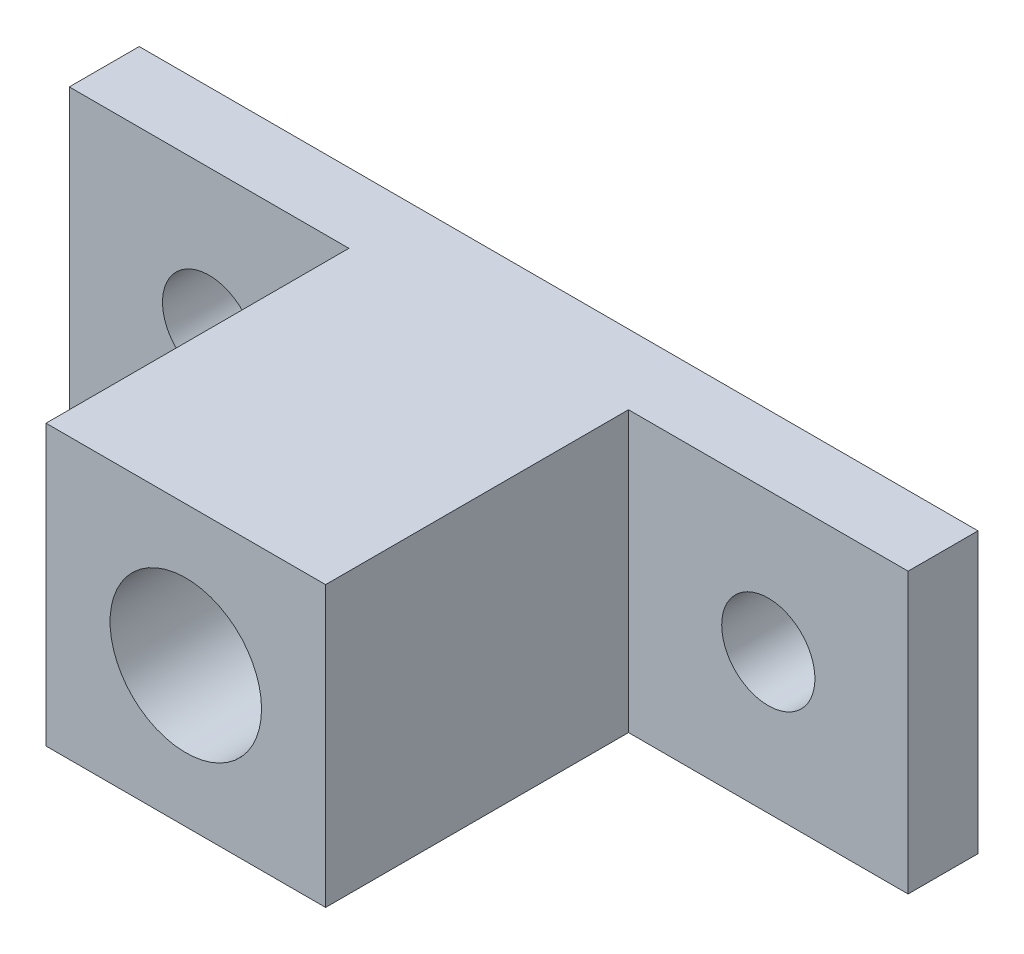
ISO-10303-21;
HEADER;
FILE_DESCRIPTION(('STEP AP214'),'2;1');
FILE_NAME('part.step','',(''),(''),'','','');
FILE_SCHEMA(('AUTOMOTIVE_DESIGN { 1 0 10303 214 1 1 1 1 }'));
ENDSEC;
DATA;
#1=APPLICATION_CONTEXT('core data for automotive mechanical design processes');
#2=APPLICATION_PROTOCOL_DEFINITION('international standard','automotive_design',2000,#1);
#3=PRODUCT_CONTEXT('',#1,'mechanical');
#4=PRODUCT('Part','Part','',(#3));
#5=PRODUCT_RELATED_PRODUCT_CATEGORY('part','',(#4));
#6=PRODUCT_DEFINITION_FORMATION('','',#4);
#7=PRODUCT_DEFINITION_CONTEXT('part definition',#1,'design');
#8=PRODUCT_DEFINITION('design','',#6,#7);
#9=PRODUCT_DEFINITION_SHAPE('','',#8);
#10=(LENGTH_UNIT() NAMED_UNIT(*) SI_UNIT(.MILLI.,.METRE.));
#11=(NAMED_UNIT(*) PLANE_ANGLE_UNIT() SI_UNIT($,.RADIAN.));
#12=(NAMED_UNIT(*) SI_UNIT($,.STERADIAN.) SOLID_ANGLE_UNIT());
#13=UNCERTAINTY_MEASURE_WITH_UNIT(LENGTH_MEASURE(1.E-05),#10,'distance_accuracy_value','');
#14=(GEOMETRIC_REPRESENTATION_CONTEXT(3) GLOBAL_UNCERTAINTY_ASSIGNED_CONTEXT((#13)) GLOBAL_UNIT_ASSIGNED_CONTEXT((#10,
#11,#12)) REPRESENTATION_CONTEXT('',''));
#15=CARTESIAN_POINT('',(0.,0.,0.));
#16=DIRECTION('',(0.,0.,1.));
#17=DIRECTION('',(1.,0.,0.));
#18=AXIS2_PLACEMENT_3D('',#15,#16,#17);
#19=CARTESIAN_POINT('',(18.,-6.,8.));
#20=DIRECTION('',(-1.,0.,0.));
#21=DIRECTION('',(0.,0.,1.));
#22=AXIS2_PLACEMENT_3D('',#19,#20,#21);
#23=PLANE('',#22);
#24=DIRECTION('',(0.,0.,-1.));
#25=VECTOR('',#24,1.);
#26=CARTESIAN_POINT('',(18.,6.,8.));
#27=LINE('',#26,#25);
#28=CARTESIAN_POINT('',(18.,6.,-5.));
#29=VERTEX_POINT('',#28);
#30=CARTESIAN_POINT('',(18.,6.,-8.));
#31=VERTEX_POINT('',#30);
#32=EDGE_CURVE('E11',#29,#31,#27,.T.);
#33=ORIENTED_EDGE('',*,*,#32,.F.);
#34=DIRECTION('',(0.,-1.,0.));
#35=VECTOR('',#34,1.);
#36=CARTESIAN_POINT('',(18.,6.,-5.));
#37=LINE('',#36,#35);
#38=CARTESIAN_POINT('',(18.,-6.,-5.));
#39=VERTEX_POINT('',#38);
#40=EDGE_CURVE('E174',#29,#39,#37,.T.);
#41=ORIENTED_EDGE('',*,*,#40,.T.);
#42=DIRECTION('',(0.,0.,-1.));
#43=VECTOR('',#42,1.);
#44=CARTESIAN_POINT('',(18.,-6.,8.));
#45=LINE('',#44,#43);
#46=CARTESIAN_POINT('',(18.,-6.,-8.));
#47=VERTEX_POINT('',#46);
#48=EDGE_CURVE('E132',#39,#47,#45,.T.);
#49=ORIENTED_EDGE('',*,*,#48,.T.);
#50=DIRECTION('',(0.,1.,0.));
#51=VECTOR('',#50,1.);
#52=CARTESIAN_POINT('',(18.,-6.,-8.));
#53=LINE('',#52,#51);
#54=EDGE_CURVE('E148',#47,#31,#53,.T.);
#55=ORIENTED_EDGE('',*,*,#54,.T.);
#56=EDGE_LOOP('',(#33,#41,#49,#55));
#57=FACE_BOUND('',#56,.T.);
#58=ADVANCED_FACE('F41',(#57),#23,.F.);
#59=CARTESIAN_POINT('',(-18.,6.,8.));
#60=DIRECTION('',(0.,-1.,0.));
#61=DIRECTION('',(0.,0.,-1.));
#62=AXIS2_PLACEMENT_3D('',#59,#60,#61);
#63=PLANE('',#62);
#64=DIRECTION('',(1.,0.,0.));
#65=VECTOR('',#64,1.);
#66=CARTESIAN_POINT('',(-18.,6.,-5.));
#67=LINE('',#66,#65);
#68=CARTESIAN_POINT('',(-18.,6.,-5.));
#69=VERTEX_POINT('',#68);
#70=CARTESIAN_POINT('',(-6.,6.,-5.));
#71=VERTEX_POINT('',#70);
#72=EDGE_CURVE('E104',#69,#71,#67,.T.);
#73=ORIENTED_EDGE('',*,*,#72,.T.);
#74=DIRECTION('',(0.,0.,1.));
#75=VECTOR('',#74,1.);
#76=CARTESIAN_POINT('',(-6.,6.,-5.));
#77=LINE('',#76,#75);
#78=CARTESIAN_POINT('',(-6.,6.,8.));
#79=VERTEX_POINT('',#78);
#80=EDGE_CURVE('E116',#71,#79,#77,.T.);
#81=ORIENTED_EDGE('',*,*,#80,.T.);
#82=DIRECTION('',(-1.,0.,0.));
#83=VECTOR('',#82,1.);
#84=CARTESIAN_POINT('',(-18.,6.,8.));
#85=LINE('',#84,#83);
#86=CARTESIAN_POINT('',(6.,6.,8.));
#87=VERTEX_POINT('',#86);
#88=EDGE_CURVE('E142',#87,#79,#85,.T.);
#89=ORIENTED_EDGE('',*,*,#88,.F.);
#90=DIRECTION('',(0.,0.,-1.));
#91=VECTOR('',#90,1.);
#92=CARTESIAN_POINT('',(6.,6.,-5.));
#93=LINE('',#92,#91);
#94=CARTESIAN_POINT('',(6.,6.,-5.));
#95=VERTEX_POINT('',#94);
#96=EDGE_CURVE('E64',#87,#95,#93,.T.);
#97=ORIENTED_EDGE('',*,*,#96,.T.);
#98=DIRECTION('',(1.,0.,0.));
#99=VECTOR('',#98,1.);
#100=CARTESIAN_POINT('',(18.,6.,-5.));
#101=LINE('',#100,#99);
#102=EDGE_CURVE('E171',#95,#29,#101,.T.);
#103=ORIENTED_EDGE('',*,*,#102,.T.);
#104=ORIENTED_EDGE('',*,*,#32,.T.);
#105=DIRECTION('',(-1.,0.,0.));
#106=VECTOR('',#105,1.);
#107=CARTESIAN_POINT('',(-18.,6.,-8.));
#108=LINE('',#107,#106);
#109=CARTESIAN_POINT('',(-18.,6.,-8.));
#110=VERTEX_POINT('',#109);
#111=EDGE_CURVE('E128',#31,#110,#108,.T.);
#112=ORIENTED_EDGE('',*,*,#111,.T.);
#113=DIRECTION('',(0.,0.,-1.));
#114=VECTOR('',#113,1.);
#115=CARTESIAN_POINT('',(-18.,6.,8.));
#116=LINE('',#115,#114);
#117=EDGE_CURVE('E49',#69,#110,#116,.T.);
#118=ORIENTED_EDGE('',*,*,#117,.F.);
#119=EDGE_LOOP('',(#73,#81,#89,#97,#103,#104,#112,#118));
#120=FACE_BOUND('',#119,.T.);
#121=ADVANCED_FACE('F126',(#120),#63,.F.);
#122=CARTESIAN_POINT('',(-18.,-6.,8.));
#123=DIRECTION('',(1.,0.,0.));
#124=DIRECTION('',(0.,0.,-1.));
#125=AXIS2_PLACEMENT_3D('',#122,#123,#124);
#126=PLANE('',#125);
#127=DIRECTION('',(0.,0.,-1.));
#128=VECTOR('',#127,1.);
#129=CARTESIAN_POINT('',(-18.,-6.,8.));
#130=LINE('',#129,#128);
#131=CARTESIAN_POINT('',(-18.,-6.,-5.));
#132=VERTEX_POINT('',#131);
#133=CARTESIAN_POINT('',(-18.,-6.,-8.));
#134=VERTEX_POINT('',#133);
#135=EDGE_CURVE('E123',#132,#134,#130,.T.);
#136=ORIENTED_EDGE('',*,*,#135,.F.);
#137=DIRECTION('',(0.,-1.,0.));
#138=VECTOR('',#137,1.);
#139=CARTESIAN_POINT('',(-18.,6.,-5.));
#140=LINE('',#139,#138);
#141=EDGE_CURVE('E108',#69,#132,#140,.T.);
#142=ORIENTED_EDGE('',*,*,#141,.F.);
#143=ORIENTED_EDGE('',*,*,#117,.T.);
#144=DIRECTION('',(0.,-1.,0.));
#145=VECTOR('',#144,1.);
#146=CARTESIAN_POINT('',(-18.,-6.,-8.));
#147=LINE('',#146,#145);
#148=EDGE_CURVE('E143',#110,#134,#147,.T.);
#149=ORIENTED_EDGE('',*,*,#148,.T.);
#150=EDGE_LOOP('',(#136,#142,#143,#149));
#151=FACE_BOUND('',#150,.T.);
#152=ADVANCED_FACE('F120',(#151),#126,.F.);
#153=CARTESIAN_POINT('',(-18.,-6.,8.));
#154=DIRECTION('',(0.,1.,0.));
#155=DIRECTION('',(0.,0.,1.));
#156=AXIS2_PLACEMENT_3D('',#153,#154,#155);
#157=PLANE('',#156);
#158=DIRECTION('',(1.,0.,0.));
#159=VECTOR('',#158,1.);
#160=CARTESIAN_POINT('',(-18.,-6.,8.));
#161=LINE('',#160,#159);
#162=CARTESIAN_POINT('',(-6.,-6.,8.));
#163=VERTEX_POINT('',#162);
#164=CARTESIAN_POINT('',(6.,-6.,8.));
#165=VERTEX_POINT('',#164);
#166=EDGE_CURVE('E137',#163,#165,#161,.T.);
#167=ORIENTED_EDGE('',*,*,#166,.F.);
#168=DIRECTION('',(0.,0.,1.));
#169=VECTOR('',#168,1.);
#170=CARTESIAN_POINT('',(-6.,-6.,-5.));
#171=LINE('',#170,#169);
#172=CARTESIAN_POINT('',(-6.,-6.,-5.));
#173=VERTEX_POINT('',#172);
#174=EDGE_CURVE('E56',#173,#163,#171,.T.);
#175=ORIENTED_EDGE('',*,*,#174,.F.);
#176=DIRECTION('',(1.,0.,0.));
#177=VECTOR('',#176,1.);
#178=CARTESIAN_POINT('',(-18.,-6.,-5.));
#179=LINE('',#178,#177);
#180=EDGE_CURVE('E178',#132,#173,#179,.T.);
#181=ORIENTED_EDGE('',*,*,#180,.F.);
#182=ORIENTED_EDGE('',*,*,#135,.T.);
#183=DIRECTION('',(1.,0.,0.));
#184=VECTOR('',#183,1.);
#185=CARTESIAN_POINT('',(-18.,-6.,-8.));
#186=LINE('',#185,#184);
#187=EDGE_CURVE('E138',#134,#47,#186,.T.);
#188=ORIENTED_EDGE('',*,*,#187,.T.);
#189=ORIENTED_EDGE('',*,*,#48,.F.);
#190=DIRECTION('',(1.,0.,0.));
#191=VECTOR('',#190,1.);
#192=CARTESIAN_POINT('',(18.,-6.,-5.));
#193=LINE('',#192,#191);
#194=CARTESIAN_POINT('',(6.,-6.,-5.));
#195=VERTEX_POINT('',#194);
#196=EDGE_CURVE('E179',#195,#39,#193,.T.);
#197=ORIENTED_EDGE('',*,*,#196,.F.);
#198=DIRECTION('',(0.,0.,-1.));
#199=VECTOR('',#198,1.);
#200=CARTESIAN_POINT('',(6.,-6.,-5.));
#201=LINE('',#200,#199);
#202=EDGE_CURVE('E182',#165,#195,#201,.T.);
#203=ORIENTED_EDGE('',*,*,#202,.F.);
#204=EDGE_LOOP('',(#167,#175,#181,#182,#188,#189,#197,#203));
#205=FACE_BOUND('',#204,.T.);
#206=ADVANCED_FACE('F247',(#205),#157,.F.);
#207=CARTESIAN_POINT('',(0.,0.,8.));
#208=DIRECTION('',(0.,0.,-1.));
#209=DIRECTION('',(-1.,0.,0.));
#210=AXIS2_PLACEMENT_3D('',#207,#208,#209);
#211=PLANE('',#210);
#212=CARTESIAN_POINT('',(0.,0.,8.));
#213=DIRECTION('',(0.,0.,1.));
#214=DIRECTION('',(1.,0.,0.));
#215=AXIS2_PLACEMENT_3D('',#212,#213,#214);
#216=CIRCLE('',#215,3.25);
#217=CARTESIAN_POINT('',(3.25,0.,8.));
#218=VERTEX_POINT('',#217);
#219=EDGE_CURVE('E159',#218,#218,#216,.T.);
#220=ORIENTED_EDGE('',*,*,#219,.F.);
#221=EDGE_LOOP('',(#220));
#222=FACE_BOUND('',#221,.T.);
#223=ORIENTED_EDGE('',*,*,#88,.T.);
#224=DIRECTION('',(0.,-1.,0.));
#225=VECTOR('',#224,1.);
#226=CARTESIAN_POINT('',(-6.,6.,8.));
#227=LINE('',#226,#225);
#228=EDGE_CURVE('E163',#79,#163,#227,.T.);
#229=ORIENTED_EDGE('',*,*,#228,.T.);
#230=ORIENTED_EDGE('',*,*,#166,.T.);
#231=DIRECTION('',(0.,-1.,0.));
#232=VECTOR('',#231,1.);
#233=CARTESIAN_POINT('',(6.,6.,8.));
#234=LINE('',#233,#232);
#235=EDGE_CURVE('E167',#87,#165,#234,.T.);
#236=ORIENTED_EDGE('',*,*,#235,.F.);
#237=EDGE_LOOP('',(#223,#229,#230,#236));
#238=FACE_BOUND('',#237,.T.);
#239=ADVANCED_FACE('F251',(#222,#238),#211,.F.);
#240=CARTESIAN_POINT('',(0.,0.,-8.));
#241=DIRECTION('',(0.,0.,-1.));
#242=DIRECTION('',(-1.,0.,0.));
#243=AXIS2_PLACEMENT_3D('',#240,#241,#242);
#244=PLANE('',#243);
#245=CARTESIAN_POINT('',(-12.,0.,-8.));
#246=DIRECTION('',(0.,0.,-1.));
#247=DIRECTION('',(-1.,0.,0.));
#248=AXIS2_PLACEMENT_3D('',#245,#246,#247);
#249=CIRCLE('',#248,2.);
#250=CARTESIAN_POINT('',(-14.,0.,-8.));
#251=VERTEX_POINT('',#250);
#252=EDGE_CURVE('E205',#251,#251,#249,.T.);
#253=ORIENTED_EDGE('',*,*,#252,.F.);
#254=EDGE_LOOP('',(#253));
#255=FACE_BOUND('',#254,.T.);
#256=CARTESIAN_POINT('',(12.,0.,-8.));
#257=DIRECTION('',(0.,0.,-1.));
#258=DIRECTION('',(-1.,0.,0.));
#259=AXIS2_PLACEMENT_3D('',#256,#257,#258);
#260=CIRCLE('',#259,2.);
#261=CARTESIAN_POINT('',(10.,0.,-8.));
#262=VERTEX_POINT('',#261);
#263=EDGE_CURVE('E186',#262,#262,#260,.T.);
#264=ORIENTED_EDGE('',*,*,#263,.F.);
#265=EDGE_LOOP('',(#264));
#266=FACE_BOUND('',#265,.T.);
#267=ORIENTED_EDGE('',*,*,#54,.F.);
#268=ORIENTED_EDGE('',*,*,#187,.F.);
#269=ORIENTED_EDGE('',*,*,#148,.F.);
#270=ORIENTED_EDGE('',*,*,#111,.F.);
#271=EDGE_LOOP('',(#267,#268,#269,#270));
#272=FACE_BOUND('',#271,.T.);
#273=ADVANCED_FACE('F243',(#255,#266,#272),#244,.T.);
#274=CARTESIAN_POINT('',(0.,0.,0.));
#275=DIRECTION('',(0.,0.,1.));
#276=DIRECTION('',(1.,0.,0.));
#277=AXIS2_PLACEMENT_3D('',#274,#275,#276);
#278=CYLINDRICAL_SURFACE('',#277,3.25);
#279=CARTESIAN_POINT('',(0.,0.,0.));
#280=DIRECTION('',(0.,0.,1.));
#281=DIRECTION('',(1.,0.,0.));
#282=AXIS2_PLACEMENT_3D('',#279,#280,#281);
#283=CIRCLE('',#282,3.25);
#284=CARTESIAN_POINT('',(3.25,0.,0.));
#285=VERTEX_POINT('',#284);
#286=EDGE_CURVE('E152',#285,#285,#283,.T.);
#287=ORIENTED_EDGE('',*,*,#286,.F.);
#288=EDGE_LOOP('',(#287));
#289=FACE_BOUND('',#288,.T.);
#290=ORIENTED_EDGE('',*,*,#219,.T.);
#291=EDGE_LOOP('',(#290));
#292=FACE_BOUND('',#291,.T.);
#293=ADVANCED_FACE('F263',(#289,#292),#278,.F.);
#294=CARTESIAN_POINT('',(0.,0.,0.));
#295=DIRECTION('',(0.,0.,1.));
#296=DIRECTION('',(1.,0.,0.));
#297=AXIS2_PLACEMENT_3D('',#294,#295,#296);
#298=PLANE('',#297);
#299=ORIENTED_EDGE('',*,*,#286,.T.);
#300=EDGE_LOOP('',(#299));
#301=FACE_BOUND('',#300,.T.);
#302=ADVANCED_FACE('F256',(#301),#298,.T.);
#303=CARTESIAN_POINT('',(18.,6.,-5.));
#304=DIRECTION('',(0.,0.,-1.));
#305=DIRECTION('',(-1.,0.,0.));
#306=AXIS2_PLACEMENT_3D('',#303,#304,#305);
#307=PLANE('',#306);
#308=CARTESIAN_POINT('',(12.,0.,-5.));
#309=DIRECTION('',(0.,0.,1.));
#310=DIRECTION('',(-1.,0.,0.));
#311=AXIS2_PLACEMENT_3D('',#308,#309,#310);
#312=CIRCLE('',#311,2.);
#313=CARTESIAN_POINT('',(10.,0.,-5.));
#314=VERTEX_POINT('',#313);
#315=EDGE_CURVE('E210',#314,#314,#312,.T.);
#316=ORIENTED_EDGE('',*,*,#315,.F.);
#317=EDGE_LOOP('',(#316));
#318=FACE_BOUND('',#317,.T.);
#319=ORIENTED_EDGE('',*,*,#196,.T.);
#320=ORIENTED_EDGE('',*,*,#40,.F.);
#321=ORIENTED_EDGE('',*,*,#102,.F.);
#322=DIRECTION('',(0.,-1.,0.));
#323=VECTOR('',#322,1.);
#324=CARTESIAN_POINT('',(6.,6.,-5.));
#325=LINE('',#324,#323);
#326=EDGE_CURVE('E170',#95,#195,#325,.T.);
#327=ORIENTED_EDGE('',*,*,#326,.T.);
#328=EDGE_LOOP('',(#319,#320,#321,#327));
#329=FACE_BOUND('',#328,.T.);
#330=ADVANCED_FACE('F254',(#318,#329),#307,.F.);
#331=CARTESIAN_POINT('',(6.,6.,-5.));
#332=DIRECTION('',(-1.,0.,0.));
#333=DIRECTION('',(0.,0.,1.));
#334=AXIS2_PLACEMENT_3D('',#331,#332,#333);
#335=PLANE('',#334);
#336=ORIENTED_EDGE('',*,*,#202,.T.);
#337=ORIENTED_EDGE('',*,*,#326,.F.);
#338=ORIENTED_EDGE('',*,*,#96,.F.);
#339=ORIENTED_EDGE('',*,*,#235,.T.);
#340=EDGE_LOOP('',(#336,#337,#338,#339));
#341=FACE_BOUND('',#340,.T.);
#342=ADVANCED_FACE('F230',(#341),#335,.F.);
#343=CARTESIAN_POINT('',(-6.,6.,-5.));
#344=DIRECTION('',(1.,0.,0.));
#345=DIRECTION('',(0.,0.,-1.));
#346=AXIS2_PLACEMENT_3D('',#343,#344,#345);
#347=PLANE('',#346);
#348=ORIENTED_EDGE('',*,*,#174,.T.);
#349=ORIENTED_EDGE('',*,*,#228,.F.);
#350=ORIENTED_EDGE('',*,*,#80,.F.);
#351=DIRECTION('',(0.,-1.,0.));
#352=VECTOR('',#351,1.);
#353=CARTESIAN_POINT('',(-6.,6.,-5.));
#354=LINE('',#353,#352);
#355=EDGE_CURVE('E110',#71,#173,#354,.T.);
#356=ORIENTED_EDGE('',*,*,#355,.T.);
#357=EDGE_LOOP('',(#348,#349,#350,#356));
#358=FACE_BOUND('',#357,.T.);
#359=ADVANCED_FACE('F221',(#358),#347,.F.);
#360=CARTESIAN_POINT('',(-18.,6.,-5.));
#361=DIRECTION('',(0.,0.,-1.));
#362=DIRECTION('',(-1.,0.,0.));
#363=AXIS2_PLACEMENT_3D('',#360,#361,#362);
#364=PLANE('',#363);
#365=CARTESIAN_POINT('',(-12.,0.,-5.));
#366=DIRECTION('',(0.,0.,1.));
#367=DIRECTION('',(1.,0.,0.));
#368=AXIS2_PLACEMENT_3D('',#365,#366,#367);
#369=CIRCLE('',#368,2.);
#370=CARTESIAN_POINT('',(-10.,0.,-5.));
#371=VERTEX_POINT('',#370);
#372=EDGE_CURVE('E209',#371,#371,#369,.T.);
#373=ORIENTED_EDGE('',*,*,#372,.F.);
#374=EDGE_LOOP('',(#373));
#375=FACE_BOUND('',#374,.T.);
#376=ORIENTED_EDGE('',*,*,#180,.T.);
#377=ORIENTED_EDGE('',*,*,#355,.F.);
#378=ORIENTED_EDGE('',*,*,#72,.F.);
#379=ORIENTED_EDGE('',*,*,#141,.T.);
#380=EDGE_LOOP('',(#376,#377,#378,#379));
#381=FACE_BOUND('',#380,.T.);
#382=ADVANCED_FACE('F107',(#375,#381),#364,.F.);
#383=CARTESIAN_POINT('',(-12.,0.,-13.));
#384=DIRECTION('',(0.,0.,1.));
#385=DIRECTION('',(1.,0.,0.));
#386=AXIS2_PLACEMENT_3D('',#383,#384,#385);
#387=CYLINDRICAL_SURFACE('',#386,2.);
#388=ORIENTED_EDGE('',*,*,#252,.T.);
#389=EDGE_LOOP('',(#388));
#390=FACE_BOUND('',#389,.T.);
#391=ORIENTED_EDGE('',*,*,#372,.T.);
#392=EDGE_LOOP('',(#391));
#393=FACE_BOUND('',#392,.T.);
#394=ADVANCED_FACE('F218',(#390,#393),#387,.F.);
#395=CARTESIAN_POINT('',(12.,0.,-13.));
#396=DIRECTION('',(0.,0.,1.));
#397=DIRECTION('',(1.,0.,0.));
#398=AXIS2_PLACEMENT_3D('',#395,#396,#397);
#399=CYLINDRICAL_SURFACE('',#398,2.);
#400=ORIENTED_EDGE('',*,*,#263,.T.);
#401=EDGE_LOOP('',(#400));
#402=FACE_BOUND('',#401,.T.);
#403=ORIENTED_EDGE('',*,*,#315,.T.);
#404=EDGE_LOOP('',(#403));
#405=FACE_BOUND('',#404,.T.);
#406=ADVANCED_FACE('F227',(#402,#405),#399,.F.);
#407=CLOSED_SHELL('',(#58,#121,#152,#206,#239,#273,#293,#302,#330,#342,#359,#382,#394,#406));
#408=MANIFOLD_SOLID_BREP('B2',#407);
#409=ADVANCED_BREP_SHAPE_REPRESENTATION('',(#18,#408),#14);
#410=SHAPE_DEFINITION_REPRESENTATION(#9,#409);
ENDSEC;
END-ISO-10303-21;
